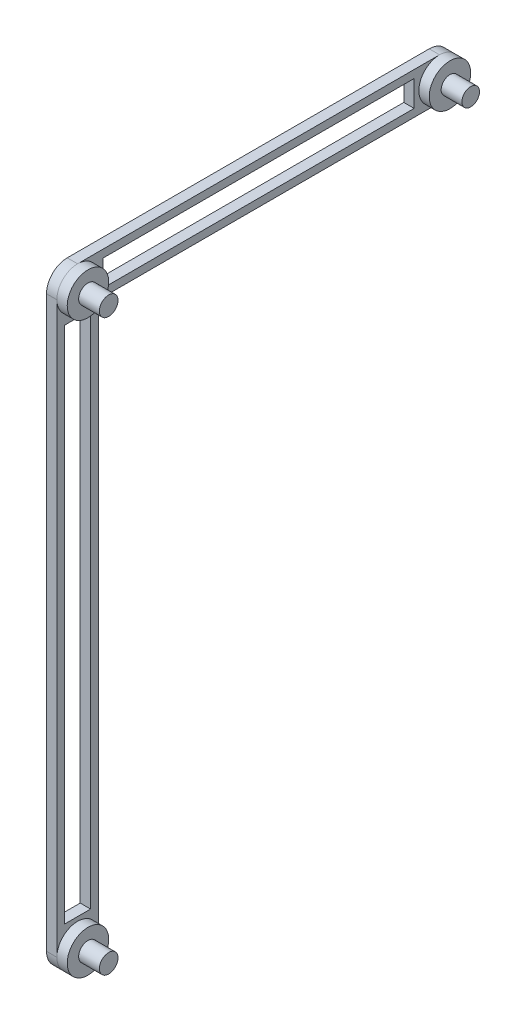
ISO-10303-21;
HEADER;
FILE_DESCRIPTION(('STEP AP214'),'2;1');
FILE_NAME('part.step','',(''),(''),'','','');
FILE_SCHEMA(('AUTOMOTIVE_DESIGN { 1 0 10303 214 1 1 1 1 }'));
ENDSEC;
DATA;
#1=APPLICATION_CONTEXT('core data for automotive mechanical design processes');
#2=APPLICATION_PROTOCOL_DEFINITION('international standard','automotive_design',2000,#1);
#3=PRODUCT_CONTEXT('',#1,'mechanical');
#4=PRODUCT('Part','Part','',(#3));
#5=PRODUCT_RELATED_PRODUCT_CATEGORY('part','',(#4));
#6=PRODUCT_DEFINITION_FORMATION('','',#4);
#7=PRODUCT_DEFINITION_CONTEXT('part definition',#1,'design');
#8=PRODUCT_DEFINITION('design','',#6,#7);
#9=PRODUCT_DEFINITION_SHAPE('','',#8);
#10=(LENGTH_UNIT() NAMED_UNIT(*) SI_UNIT(.MILLI.,.METRE.));
#11=(NAMED_UNIT(*) PLANE_ANGLE_UNIT() SI_UNIT($,.RADIAN.));
#12=(NAMED_UNIT(*) SI_UNIT($,.STERADIAN.) SOLID_ANGLE_UNIT());
#13=UNCERTAINTY_MEASURE_WITH_UNIT(LENGTH_MEASURE(1.E-05),#10,'distance_accuracy_value','');
#14=(GEOMETRIC_REPRESENTATION_CONTEXT(3) GLOBAL_UNCERTAINTY_ASSIGNED_CONTEXT((#13)) GLOBAL_UNIT_ASSIGNED_CONTEXT((#10,
#11,#12)) REPRESENTATION_CONTEXT('',''));
#15=CARTESIAN_POINT('',(0.,0.,0.));
#16=DIRECTION('',(0.,0.,1.));
#17=DIRECTION('',(1.,0.,0.));
#18=AXIS2_PLACEMENT_3D('',#15,#16,#17);
#19=CARTESIAN_POINT('',(1.,0.,0.));
#20=DIRECTION('',(1.,0.,0.));
#21=DIRECTION('',(0.,0.,-1.));
#22=AXIS2_PLACEMENT_3D('',#19,#20,#21);
#23=PLANE('',#22);
#24=DIRECTION('',(0.,1.,0.));
#25=VECTOR('',#24,1.);
#26=CARTESIAN_POINT('',(1.,1.25,-15.));
#27=LINE('',#26,#25);
#28=CARTESIAN_POINT('',(1.,-1.25,-15.));
#29=VERTEX_POINT('',#28);
#30=CARTESIAN_POINT('',(1.,1.25,-15.));
#31=VERTEX_POINT('',#30);
#32=EDGE_CURVE('E175',#29,#31,#27,.T.);
#33=ORIENTED_EDGE('',*,*,#32,.F.);
#34=DIRECTION('',(0.,0.,-1.));
#35=VECTOR('',#34,1.);
#36=CARTESIAN_POINT('',(1.,-1.25,15.));
#37=LINE('',#36,#35);
#38=CARTESIAN_POINT('',(1.,-1.25,15.));
#39=VERTEX_POINT('',#38);
#40=EDGE_CURVE('E179',#39,#29,#37,.T.);
#41=ORIENTED_EDGE('',*,*,#40,.F.);
#42=DIRECTION('',(0.,-1.,0.));
#43=VECTOR('',#42,1.);
#44=CARTESIAN_POINT('',(1.,1.25,15.));
#45=LINE('',#44,#43);
#46=CARTESIAN_POINT('',(1.,1.25,15.));
#47=VERTEX_POINT('',#46);
#48=EDGE_CURVE('E159',#47,#39,#45,.T.);
#49=ORIENTED_EDGE('',*,*,#48,.F.);
#50=DIRECTION('',(0.,0.,1.));
#51=VECTOR('',#50,1.);
#52=CARTESIAN_POINT('',(1.,1.25,15.));
#53=LINE('',#52,#51);
#54=EDGE_CURVE('E170',#31,#47,#53,.T.);
#55=ORIENTED_EDGE('',*,*,#54,.F.);
#56=EDGE_LOOP('',(#33,#41,#49,#55));
#57=FACE_BOUND('',#56,.T.);
#58=DIRECTION('',(0.,1.,0.));
#59=VECTOR('',#58,1.);
#60=CARTESIAN_POINT('',(1.,-2.5,16.2));
#61=LINE('',#60,#59);
#62=CARTESIAN_POINT('',(1.,-52.5,16.2));
#63=VERTEX_POINT('',#62);
#64=CARTESIAN_POINT('',(1.,-2.5,16.2));
#65=VERTEX_POINT('',#64);
#66=EDGE_CURVE('E201',#63,#65,#61,.T.);
#67=ORIENTED_EDGE('',*,*,#66,.F.);
#68=DIRECTION('',(0.,0.,-1.));
#69=VECTOR('',#68,1.);
#70=CARTESIAN_POINT('',(1.,-52.5,18.7));
#71=LINE('',#70,#69);
#72=CARTESIAN_POINT('',(1.,-52.5,18.7));
#73=VERTEX_POINT('',#72);
#74=EDGE_CURVE('E210',#73,#63,#71,.T.);
#75=ORIENTED_EDGE('',*,*,#74,.F.);
#76=DIRECTION('',(0.,-1.,0.));
#77=VECTOR('',#76,1.);
#78=CARTESIAN_POINT('',(1.,-2.5,18.7));
#79=LINE('',#78,#77);
#80=CARTESIAN_POINT('',(1.,-2.5,18.7));
#81=VERTEX_POINT('',#80);
#82=EDGE_CURVE('E207',#81,#73,#79,.T.);
#83=ORIENTED_EDGE('',*,*,#82,.F.);
#84=DIRECTION('',(0.,0.,1.));
#85=VECTOR('',#84,1.);
#86=CARTESIAN_POINT('',(1.,-2.5,18.7));
#87=LINE('',#86,#85);
#88=EDGE_CURVE('E203',#65,#81,#87,.T.);
#89=ORIENTED_EDGE('',*,*,#88,.F.);
#90=EDGE_LOOP('',(#67,#75,#83,#89));
#91=FACE_BOUND('',#90,.T.);
#92=DIRECTION('',(0.,0.,-1.));
#93=VECTOR('',#92,1.);
#94=CARTESIAN_POINT('',(1.,-2.,0.));
#95=LINE('',#94,#93);
#96=CARTESIAN_POINT('',(1.,-2.,15.45));
#97=VERTEX_POINT('',#96);
#98=CARTESIAN_POINT('',(1.,-2.,-17.45));
#99=VERTEX_POINT('',#98);
#100=EDGE_CURVE('E264',#97,#99,#95,.T.);
#101=ORIENTED_EDGE('',*,*,#100,.T.);
#102=CARTESIAN_POINT('',(1.,0.,-17.45));
#103=DIRECTION('',(1.,0.,0.));
#104=DIRECTION('',(0.,0.,-1.));
#105=AXIS2_PLACEMENT_3D('',#102,#103,#104);
#106=CIRCLE('',#105,2.);
#107=CARTESIAN_POINT('',(1.,2.,-17.45));
#108=VERTEX_POINT('',#107);
#109=EDGE_CURVE('E248',#108,#99,#106,.T.);
#110=ORIENTED_EDGE('',*,*,#109,.F.);
#111=DIRECTION('',(0.,0.,-1.));
#112=VECTOR('',#111,1.);
#113=CARTESIAN_POINT('',(1.,2.,0.));
#114=LINE('',#113,#112);
#115=CARTESIAN_POINT('',(1.,2.,17.45));
#116=VERTEX_POINT('',#115);
#117=EDGE_CURVE('E268',#116,#108,#114,.T.);
#118=ORIENTED_EDGE('',*,*,#117,.F.);
#119=CARTESIAN_POINT('',(1.,0.,17.45));
#120=DIRECTION('',(1.,0.,0.));
#121=DIRECTION('',(0.,0.,-1.));
#122=AXIS2_PLACEMENT_3D('',#119,#120,#121);
#123=CIRCLE('',#122,2.);
#124=CARTESIAN_POINT('',(1.,0.,19.45));
#125=VERTEX_POINT('',#124);
#126=EDGE_CURVE('E245',#125,#116,#123,.T.);
#127=ORIENTED_EDGE('',*,*,#126,.F.);
#128=DIRECTION('',(0.,-1.,0.));
#129=VECTOR('',#128,1.);
#130=CARTESIAN_POINT('',(1.,0.,19.45));
#131=LINE('',#130,#129);
#132=CARTESIAN_POINT('',(1.,-54.9,19.45));
#133=VERTEX_POINT('',#132);
#134=EDGE_CURVE('E271',#125,#133,#131,.T.);
#135=ORIENTED_EDGE('',*,*,#134,.T.);
#136=CARTESIAN_POINT('',(1.,-54.9,17.45));
#137=DIRECTION('',(1.,0.,0.));
#138=DIRECTION('',(0.,0.,-1.));
#139=AXIS2_PLACEMENT_3D('',#136,#137,#138);
#140=CIRCLE('',#139,2.);
#141=CARTESIAN_POINT('',(1.,-54.9,15.45));
#142=VERTEX_POINT('',#141);
#143=EDGE_CURVE('E252',#142,#133,#140,.T.);
#144=ORIENTED_EDGE('',*,*,#143,.F.);
#145=DIRECTION('',(0.,-1.,0.));
#146=VECTOR('',#145,1.);
#147=CARTESIAN_POINT('',(1.,0.,15.45));
#148=LINE('',#147,#146);
#149=EDGE_CURVE('E262',#97,#142,#148,.T.);
#150=ORIENTED_EDGE('',*,*,#149,.F.);
#151=EDGE_LOOP('',(#101,#110,#118,#127,#135,#144,#150));
#152=FACE_BOUND('',#151,.T.);
#153=ADVANCED_FACE('F35',(#57,#91,#152),#23,.T.);
#154=CARTESIAN_POINT('',(1.,0.,15.45));
#155=DIRECTION('',(0.,0.,-1.));
#156=DIRECTION('',(0.,1.,0.));
#157=AXIS2_PLACEMENT_3D('',#154,#155,#156);
#158=PLANE('',#157);
#159=ORIENTED_EDGE('',*,*,#149,.T.);
#160=DIRECTION('',(-1.,0.,0.));
#161=VECTOR('',#160,1.);
#162=CARTESIAN_POINT('',(0.,-54.9,15.45));
#163=LINE('',#162,#161);
#164=CARTESIAN_POINT('',(0.,-54.9,15.45));
#165=VERTEX_POINT('',#164);
#166=EDGE_CURVE('E228',#142,#165,#163,.T.);
#167=ORIENTED_EDGE('',*,*,#166,.T.);
#168=DIRECTION('',(0.,-1.,0.));
#169=VECTOR('',#168,1.);
#170=CARTESIAN_POINT('',(0.,0.,15.45));
#171=LINE('',#170,#169);
#172=CARTESIAN_POINT('',(0.,-2.,15.45));
#173=VERTEX_POINT('',#172);
#174=EDGE_CURVE('E258',#173,#165,#171,.T.);
#175=ORIENTED_EDGE('',*,*,#174,.F.);
#176=DIRECTION('',(-1.,0.,0.));
#177=VECTOR('',#176,1.);
#178=CARTESIAN_POINT('',(1.,-2.,15.45));
#179=LINE('',#178,#177);
#180=EDGE_CURVE('E274',#97,#173,#179,.T.);
#181=ORIENTED_EDGE('',*,*,#180,.F.);
#182=EDGE_LOOP('',(#159,#167,#175,#181));
#183=FACE_BOUND('',#182,.T.);
#184=ADVANCED_FACE('F328',(#183),#158,.T.);
#185=CARTESIAN_POINT('',(1.,-2.,0.));
#186=DIRECTION('',(0.,1.,0.));
#187=DIRECTION('',(0.,0.,1.));
#188=AXIS2_PLACEMENT_3D('',#185,#186,#187);
#189=PLANE('',#188);
#190=DIRECTION('',(0.,0.,-1.));
#191=VECTOR('',#190,1.);
#192=CARTESIAN_POINT('',(0.,-2.,0.));
#193=LINE('',#192,#191);
#194=CARTESIAN_POINT('',(0.,-2.,-17.45));
#195=VERTEX_POINT('',#194);
#196=EDGE_CURVE('E277',#173,#195,#193,.T.);
#197=ORIENTED_EDGE('',*,*,#196,.T.);
#198=DIRECTION('',(-1.,0.,0.));
#199=VECTOR('',#198,1.);
#200=CARTESIAN_POINT('',(1.,-2.,-17.45));
#201=LINE('',#200,#199);
#202=EDGE_CURVE('E11',#195,#99,#201,.F.);
#203=ORIENTED_EDGE('',*,*,#202,.T.);
#204=ORIENTED_EDGE('',*,*,#100,.F.);
#205=ORIENTED_EDGE('',*,*,#180,.T.);
#206=EDGE_LOOP('',(#197,#203,#204,#205));
#207=FACE_BOUND('',#206,.T.);
#208=ADVANCED_FACE('F318',(#207),#189,.F.);
#209=CARTESIAN_POINT('',(1.,2.,0.));
#210=DIRECTION('',(0.,1.,0.));
#211=DIRECTION('',(0.,0.,1.));
#212=AXIS2_PLACEMENT_3D('',#209,#210,#211);
#213=PLANE('',#212);
#214=DIRECTION('',(0.,0.,-1.));
#215=VECTOR('',#214,1.);
#216=CARTESIAN_POINT('',(0.,2.,0.));
#217=LINE('',#216,#215);
#218=CARTESIAN_POINT('',(0.,2.,17.45));
#219=VERTEX_POINT('',#218);
#220=CARTESIAN_POINT('',(0.,2.,-17.45));
#221=VERTEX_POINT('',#220);
#222=EDGE_CURVE('E279',#219,#221,#217,.T.);
#223=ORIENTED_EDGE('',*,*,#222,.F.);
#224=DIRECTION('',(-1.,0.,0.));
#225=VECTOR('',#224,1.);
#226=CARTESIAN_POINT('',(1.,2.,17.45));
#227=LINE('',#226,#225);
#228=EDGE_CURVE('E44',#219,#116,#227,.F.);
#229=ORIENTED_EDGE('',*,*,#228,.T.);
#230=ORIENTED_EDGE('',*,*,#117,.T.);
#231=DIRECTION('',(-1.,0.,0.));
#232=VECTOR('',#231,1.);
#233=CARTESIAN_POINT('',(1.,2.,-17.45));
#234=LINE('',#233,#232);
#235=EDGE_CURVE('E299',#108,#221,#234,.T.);
#236=ORIENTED_EDGE('',*,*,#235,.T.);
#237=EDGE_LOOP('',(#223,#229,#230,#236));
#238=FACE_BOUND('',#237,.T.);
#239=ADVANCED_FACE('F371',(#238),#213,.T.);
#240=CARTESIAN_POINT('',(1.,0.,19.45));
#241=DIRECTION('',(0.,0.,-1.));
#242=DIRECTION('',(0.,1.,0.));
#243=AXIS2_PLACEMENT_3D('',#240,#241,#242);
#244=PLANE('',#243);
#245=DIRECTION('',(0.,-1.,0.));
#246=VECTOR('',#245,1.);
#247=CARTESIAN_POINT('',(0.,0.,19.45));
#248=LINE('',#247,#246);
#249=CARTESIAN_POINT('',(0.,0.,19.45));
#250=VERTEX_POINT('',#249);
#251=CARTESIAN_POINT('',(0.,-54.9,19.45));
#252=VERTEX_POINT('',#251);
#253=EDGE_CURVE('E265',#250,#252,#248,.T.);
#254=ORIENTED_EDGE('',*,*,#253,.T.);
#255=DIRECTION('',(-1.,0.,0.));
#256=VECTOR('',#255,1.);
#257=CARTESIAN_POINT('',(1.,-54.9,19.45));
#258=LINE('',#257,#256);
#259=EDGE_CURVE('E297',#252,#133,#258,.F.);
#260=ORIENTED_EDGE('',*,*,#259,.T.);
#261=ORIENTED_EDGE('',*,*,#134,.F.);
#262=DIRECTION('',(-1.,0.,0.));
#263=VECTOR('',#262,1.);
#264=CARTESIAN_POINT('',(0.,0.,19.45));
#265=LINE('',#264,#263);
#266=EDGE_CURVE('E294',#125,#250,#265,.T.);
#267=ORIENTED_EDGE('',*,*,#266,.T.);
#268=EDGE_LOOP('',(#254,#260,#261,#267));
#269=FACE_BOUND('',#268,.T.);
#270=ADVANCED_FACE('F340',(#269),#244,.F.);
#271=CARTESIAN_POINT('',(0.,0.,0.));
#272=DIRECTION('',(1.,0.,0.));
#273=DIRECTION('',(0.,0.,-1.));
#274=AXIS2_PLACEMENT_3D('',#271,#272,#273);
#275=PLANE('',#274);
#276=DIRECTION('',(0.,0.,1.));
#277=VECTOR('',#276,1.);
#278=CARTESIAN_POINT('',(0.,-1.25,15.));
#279=LINE('',#278,#277);
#280=CARTESIAN_POINT('',(0.,-1.25,-15.));
#281=VERTEX_POINT('',#280);
#282=CARTESIAN_POINT('',(0.,-1.25,15.));
#283=VERTEX_POINT('',#282);
#284=EDGE_CURVE('E646',#281,#283,#279,.T.);
#285=ORIENTED_EDGE('',*,*,#284,.F.);
#286=DIRECTION('',(0.,-1.,0.));
#287=VECTOR('',#286,1.);
#288=CARTESIAN_POINT('',(0.,1.25,-15.));
#289=LINE('',#288,#287);
#290=CARTESIAN_POINT('',(0.,1.25,-15.));
#291=VERTEX_POINT('',#290);
#292=EDGE_CURVE('E191',#291,#281,#289,.T.);
#293=ORIENTED_EDGE('',*,*,#292,.F.);
#294=DIRECTION('',(0.,0.,-1.));
#295=VECTOR('',#294,1.);
#296=CARTESIAN_POINT('',(0.,1.25,15.));
#297=LINE('',#296,#295);
#298=CARTESIAN_POINT('',(0.,1.25,15.));
#299=VERTEX_POINT('',#298);
#300=EDGE_CURVE('E188',#299,#291,#297,.T.);
#301=ORIENTED_EDGE('',*,*,#300,.F.);
#302=DIRECTION('',(0.,1.,0.));
#303=VECTOR('',#302,1.);
#304=CARTESIAN_POINT('',(0.,1.25,15.));
#305=LINE('',#304,#303);
#306=EDGE_CURVE('E162',#283,#299,#305,.T.);
#307=ORIENTED_EDGE('',*,*,#306,.F.);
#308=EDGE_LOOP('',(#285,#293,#301,#307));
#309=FACE_BOUND('',#308,.T.);
#310=DIRECTION('',(0.,0.,1.));
#311=VECTOR('',#310,1.);
#312=CARTESIAN_POINT('',(0.,-52.5,18.7));
#313=LINE('',#312,#311);
#314=CARTESIAN_POINT('',(0.,-52.5,16.2));
#315=VERTEX_POINT('',#314);
#316=CARTESIAN_POINT('',(0.,-52.5,18.7));
#317=VERTEX_POINT('',#316);
#318=EDGE_CURVE('E195',#315,#317,#313,.T.);
#319=ORIENTED_EDGE('',*,*,#318,.F.);
#320=DIRECTION('',(0.,-1.,0.));
#321=VECTOR('',#320,1.);
#322=CARTESIAN_POINT('',(0.,-2.5,16.2));
#323=LINE('',#322,#321);
#324=CARTESIAN_POINT('',(0.,-2.5,16.2));
#325=VERTEX_POINT('',#324);
#326=EDGE_CURVE('E198',#325,#315,#323,.T.);
#327=ORIENTED_EDGE('',*,*,#326,.F.);
#328=DIRECTION('',(0.,0.,-1.));
#329=VECTOR('',#328,1.);
#330=CARTESIAN_POINT('',(0.,-2.5,18.7));
#331=LINE('',#330,#329);
#332=CARTESIAN_POINT('',(0.,-2.5,18.7));
#333=VERTEX_POINT('',#332);
#334=EDGE_CURVE('E200',#333,#325,#331,.T.);
#335=ORIENTED_EDGE('',*,*,#334,.F.);
#336=DIRECTION('',(0.,1.,0.));
#337=VECTOR('',#336,1.);
#338=CARTESIAN_POINT('',(0.,-2.5,18.7));
#339=LINE('',#338,#337);
#340=EDGE_CURVE('E192',#317,#333,#339,.T.);
#341=ORIENTED_EDGE('',*,*,#340,.F.);
#342=EDGE_LOOP('',(#319,#327,#335,#341));
#343=FACE_BOUND('',#342,.T.);
#344=ORIENTED_EDGE('',*,*,#174,.T.);
#345=CARTESIAN_POINT('',(0.,-54.9,17.45));
#346=DIRECTION('',(1.,0.,0.));
#347=DIRECTION('',(0.,0.,-1.));
#348=AXIS2_PLACEMENT_3D('',#345,#346,#347);
#349=CIRCLE('',#348,2.);
#350=CARTESIAN_POINT('',(0.,-56.9,17.45));
#351=VERTEX_POINT('',#350);
#352=EDGE_CURVE('E292',#165,#351,#349,.F.);
#353=ORIENTED_EDGE('',*,*,#352,.T.);
#354=CARTESIAN_POINT('',(0.,-54.9,17.45));
#355=DIRECTION('',(1.,0.,0.));
#356=DIRECTION('',(0.,0.,-1.));
#357=AXIS2_PLACEMENT_3D('',#354,#355,#356);
#358=CIRCLE('',#357,2.);
#359=EDGE_CURVE('E290',#351,#252,#358,.F.);
#360=ORIENTED_EDGE('',*,*,#359,.T.);
#361=ORIENTED_EDGE('',*,*,#253,.F.);
#362=CARTESIAN_POINT('',(0.,0.,17.45));
#363=DIRECTION('',(1.,0.,0.));
#364=DIRECTION('',(0.,0.,-1.));
#365=AXIS2_PLACEMENT_3D('',#362,#363,#364);
#366=CIRCLE('',#365,2.);
#367=EDGE_CURVE('E288',#250,#219,#366,.F.);
#368=ORIENTED_EDGE('',*,*,#367,.T.);
#369=ORIENTED_EDGE('',*,*,#222,.T.);
#370=CARTESIAN_POINT('',(0.,0.,-17.45));
#371=DIRECTION('',(1.,0.,0.));
#372=DIRECTION('',(0.,0.,-1.));
#373=AXIS2_PLACEMENT_3D('',#370,#371,#372);
#374=CIRCLE('',#373,2.);
#375=CARTESIAN_POINT('',(0.,0.,-19.45));
#376=VERTEX_POINT('',#375);
#377=EDGE_CURVE('E57',#221,#376,#374,.F.);
#378=ORIENTED_EDGE('',*,*,#377,.T.);
#379=CARTESIAN_POINT('',(0.,0.,-17.45));
#380=DIRECTION('',(1.,0.,0.));
#381=DIRECTION('',(0.,0.,-1.));
#382=AXIS2_PLACEMENT_3D('',#379,#380,#381);
#383=CIRCLE('',#382,2.);
#384=EDGE_CURVE('E52',#376,#195,#383,.F.);
#385=ORIENTED_EDGE('',*,*,#384,.T.);
#386=ORIENTED_EDGE('',*,*,#196,.F.);
#387=EDGE_LOOP('',(#344,#353,#360,#361,#368,#369,#378,#385,#386));
#388=FACE_BOUND('',#387,.T.);
#389=ADVANCED_FACE('F331',(#309,#343,#388),#275,.F.);
#390=CARTESIAN_POINT('',(2.,-54.9,17.45));
#391=DIRECTION('',(-1.,0.,0.));
#392=DIRECTION('',(0.,0.,1.));
#393=AXIS2_PLACEMENT_3D('',#390,#391,#392);
#394=CYLINDRICAL_SURFACE('',#393,2.);
#395=CARTESIAN_POINT('',(2.,-54.9,17.45));
#396=DIRECTION('',(1.,0.,0.));
#397=DIRECTION('',(0.,0.,-1.));
#398=AXIS2_PLACEMENT_3D('',#395,#396,#397);
#399=CIRCLE('',#398,2.);
#400=CARTESIAN_POINT('',(2.,-54.9,15.45));
#401=VERTEX_POINT('',#400);
#402=EDGE_CURVE('E255',#401,#401,#399,.T.);
#403=ORIENTED_EDGE('',*,*,#402,.F.);
#404=EDGE_LOOP('',(#403));
#405=FACE_BOUND('',#404,.T.);
#406=ORIENTED_EDGE('',*,*,#143,.T.);
#407=CARTESIAN_POINT('',(1.,-56.9,17.45));
#408=VERTEX_POINT('',#407);
#409=EDGE_CURVE('E241',#133,#408,#140,.T.);
#410=ORIENTED_EDGE('',*,*,#409,.T.);
#411=EDGE_CURVE('E261',#408,#142,#140,.T.);
#412=ORIENTED_EDGE('',*,*,#411,.T.);
#413=EDGE_LOOP('',(#406,#410,#412));
#414=FACE_BOUND('',#413,.T.);
#415=ADVANCED_FACE('F345',(#405,#414),#394,.T.);
#416=CARTESIAN_POINT('',(2.,0.,0.));
#417=DIRECTION('',(1.,0.,0.));
#418=DIRECTION('',(0.,0.,-1.));
#419=AXIS2_PLACEMENT_3D('',#416,#417,#418);
#420=PLANE('',#419);
#421=CARTESIAN_POINT('',(2.,-54.9,17.45));
#422=DIRECTION('',(1.,0.,0.));
#423=DIRECTION('',(0.,0.,-1.));
#424=AXIS2_PLACEMENT_3D('',#421,#422,#423);
#425=CIRCLE('',#424,0.9);
#426=CARTESIAN_POINT('',(2.,-54.9,16.55));
#427=VERTEX_POINT('',#426);
#428=EDGE_CURVE('E225',#427,#427,#425,.T.);
#429=ORIENTED_EDGE('',*,*,#428,.F.);
#430=EDGE_LOOP('',(#429));
#431=FACE_BOUND('',#430,.T.);
#432=ORIENTED_EDGE('',*,*,#402,.T.);
#433=EDGE_LOOP('',(#432));
#434=FACE_BOUND('',#433,.T.);
#435=ADVANCED_FACE('F398',(#431,#434),#420,.T.);
#436=CARTESIAN_POINT('',(2.,0.,17.45));
#437=DIRECTION('',(-1.,0.,0.));
#438=DIRECTION('',(0.,0.,1.));
#439=AXIS2_PLACEMENT_3D('',#436,#437,#438);
#440=CYLINDRICAL_SURFACE('',#439,2.);
#441=CARTESIAN_POINT('',(2.,0.,17.45));
#442=DIRECTION('',(1.,0.,0.));
#443=DIRECTION('',(0.,0.,-1.));
#444=AXIS2_PLACEMENT_3D('',#441,#442,#443);
#445=CIRCLE('',#444,2.);
#446=CARTESIAN_POINT('',(2.,0.,15.45));
#447=VERTEX_POINT('',#446);
#448=EDGE_CURVE('E249',#447,#447,#445,.T.);
#449=ORIENTED_EDGE('',*,*,#448,.F.);
#450=EDGE_LOOP('',(#449));
#451=FACE_BOUND('',#450,.T.);
#452=EDGE_CURVE('E253',#116,#125,#123,.T.);
#453=ORIENTED_EDGE('',*,*,#452,.T.);
#454=ORIENTED_EDGE('',*,*,#126,.T.);
#455=EDGE_LOOP('',(#453,#454));
#456=FACE_BOUND('',#455,.T.);
#457=ADVANCED_FACE('F406',(#451,#456),#440,.T.);
#458=CARTESIAN_POINT('',(2.,0.,0.));
#459=DIRECTION('',(1.,0.,0.));
#460=DIRECTION('',(0.,0.,-1.));
#461=AXIS2_PLACEMENT_3D('',#458,#459,#460);
#462=PLANE('',#461);
#463=CARTESIAN_POINT('',(2.,0.,17.45));
#464=DIRECTION('',(1.,0.,0.));
#465=DIRECTION('',(0.,0.,-1.));
#466=AXIS2_PLACEMENT_3D('',#463,#464,#465);
#467=CIRCLE('',#466,0.9);
#468=CARTESIAN_POINT('',(2.,0.,16.55));
#469=VERTEX_POINT('',#468);
#470=EDGE_CURVE('E235',#469,#469,#467,.T.);
#471=ORIENTED_EDGE('',*,*,#470,.F.);
#472=EDGE_LOOP('',(#471));
#473=FACE_BOUND('',#472,.T.);
#474=ORIENTED_EDGE('',*,*,#448,.T.);
#475=EDGE_LOOP('',(#474));
#476=FACE_BOUND('',#475,.T.);
#477=ADVANCED_FACE('F413',(#473,#476),#462,.T.);
#478=CARTESIAN_POINT('',(2.,0.,-17.45));
#479=DIRECTION('',(-1.,0.,0.));
#480=DIRECTION('',(0.,0.,1.));
#481=AXIS2_PLACEMENT_3D('',#478,#479,#480);
#482=CYLINDRICAL_SURFACE('',#481,2.);
#483=CARTESIAN_POINT('',(2.,0.,-17.45));
#484=DIRECTION('',(1.,0.,0.));
#485=DIRECTION('',(0.,0.,-1.));
#486=AXIS2_PLACEMENT_3D('',#483,#484,#485);
#487=CIRCLE('',#486,2.);
#488=CARTESIAN_POINT('',(2.,0.,-19.45));
#489=VERTEX_POINT('',#488);
#490=EDGE_CURVE('E242',#489,#489,#487,.T.);
#491=ORIENTED_EDGE('',*,*,#490,.F.);
#492=EDGE_LOOP('',(#491));
#493=FACE_BOUND('',#492,.T.);
#494=CARTESIAN_POINT('',(1.,0.,-19.45));
#495=VERTEX_POINT('',#494);
#496=EDGE_CURVE('E246',#495,#108,#106,.T.);
#497=ORIENTED_EDGE('',*,*,#496,.T.);
#498=ORIENTED_EDGE('',*,*,#109,.T.);
#499=EDGE_CURVE('E238',#99,#495,#106,.T.);
#500=ORIENTED_EDGE('',*,*,#499,.T.);
#501=EDGE_LOOP('',(#497,#498,#500));
#502=FACE_BOUND('',#501,.T.);
#503=ADVANCED_FACE('F322',(#493,#502),#482,.T.);
#504=CARTESIAN_POINT('',(2.,0.,0.));
#505=DIRECTION('',(1.,0.,0.));
#506=DIRECTION('',(0.,0.,-1.));
#507=AXIS2_PLACEMENT_3D('',#504,#505,#506);
#508=PLANE('',#507);
#509=CARTESIAN_POINT('',(2.,0.,-17.45));
#510=DIRECTION('',(1.,0.,0.));
#511=DIRECTION('',(0.,0.,-1.));
#512=AXIS2_PLACEMENT_3D('',#509,#510,#511);
#513=CIRCLE('',#512,0.85);
#514=CARTESIAN_POINT('',(2.,0.,-18.3));
#515=VERTEX_POINT('',#514);
#516=EDGE_CURVE('E229',#515,#515,#513,.T.);
#517=ORIENTED_EDGE('',*,*,#516,.F.);
#518=EDGE_LOOP('',(#517));
#519=FACE_BOUND('',#518,.T.);
#520=ORIENTED_EDGE('',*,*,#490,.T.);
#521=EDGE_LOOP('',(#520));
#522=FACE_BOUND('',#521,.T.);
#523=ADVANCED_FACE('F428',(#519,#522),#508,.T.);
#524=CARTESIAN_POINT('',(4.,0.,17.45));
#525=DIRECTION('',(-1.,0.,0.));
#526=DIRECTION('',(0.,0.,1.));
#527=AXIS2_PLACEMENT_3D('',#524,#525,#526);
#528=CYLINDRICAL_SURFACE('',#527,0.9);
#529=CARTESIAN_POINT('',(4.,0.,17.45));
#530=DIRECTION('',(1.,0.,0.));
#531=DIRECTION('',(0.,0.,-1.));
#532=AXIS2_PLACEMENT_3D('',#529,#530,#531);
#533=CIRCLE('',#532,0.9);
#534=CARTESIAN_POINT('',(4.,0.,16.55));
#535=VERTEX_POINT('',#534);
#536=EDGE_CURVE('E232',#535,#535,#533,.T.);
#537=ORIENTED_EDGE('',*,*,#536,.F.);
#538=EDGE_LOOP('',(#537));
#539=FACE_BOUND('',#538,.T.);
#540=ORIENTED_EDGE('',*,*,#470,.T.);
#541=EDGE_LOOP('',(#540));
#542=FACE_BOUND('',#541,.T.);
#543=ADVANCED_FACE('F436',(#539,#542),#528,.T.);
#544=CARTESIAN_POINT('',(4.,0.,17.45));
#545=DIRECTION('',(1.,0.,0.));
#546=DIRECTION('',(0.,0.,-1.));
#547=AXIS2_PLACEMENT_3D('',#544,#545,#546);
#548=PLANE('',#547);
#549=ORIENTED_EDGE('',*,*,#536,.T.);
#550=EDGE_LOOP('',(#549));
#551=FACE_BOUND('',#550,.T.);
#552=ADVANCED_FACE('F444',(#551),#548,.T.);
#553=CARTESIAN_POINT('',(4.,0.,-17.45));
#554=DIRECTION('',(-1.,0.,0.));
#555=DIRECTION('',(0.,0.,1.));
#556=AXIS2_PLACEMENT_3D('',#553,#554,#555);
#557=CYLINDRICAL_SURFACE('',#556,0.85);
#558=CARTESIAN_POINT('',(4.,0.,-17.45));
#559=DIRECTION('',(1.,0.,0.));
#560=DIRECTION('',(0.,0.,-1.));
#561=AXIS2_PLACEMENT_3D('',#558,#559,#560);
#562=CIRCLE('',#561,0.85);
#563=CARTESIAN_POINT('',(4.,0.,-18.3));
#564=VERTEX_POINT('',#563);
#565=EDGE_CURVE('E224',#564,#564,#562,.T.);
#566=ORIENTED_EDGE('',*,*,#565,.F.);
#567=EDGE_LOOP('',(#566));
#568=FACE_BOUND('',#567,.T.);
#569=ORIENTED_EDGE('',*,*,#516,.T.);
#570=EDGE_LOOP('',(#569));
#571=FACE_BOUND('',#570,.T.);
#572=ADVANCED_FACE('F452',(#568,#571),#557,.T.);
#573=CARTESIAN_POINT('',(4.,0.,-17.45));
#574=DIRECTION('',(1.,0.,0.));
#575=DIRECTION('',(0.,0.,-1.));
#576=AXIS2_PLACEMENT_3D('',#573,#574,#575);
#577=PLANE('',#576);
#578=ORIENTED_EDGE('',*,*,#565,.T.);
#579=EDGE_LOOP('',(#578));
#580=FACE_BOUND('',#579,.T.);
#581=ADVANCED_FACE('F460',(#580),#577,.T.);
#582=CARTESIAN_POINT('',(4.,-54.9,17.45));
#583=DIRECTION('',(-1.,0.,0.));
#584=DIRECTION('',(0.,0.,1.));
#585=AXIS2_PLACEMENT_3D('',#582,#583,#584);
#586=CYLINDRICAL_SURFACE('',#585,0.9);
#587=CARTESIAN_POINT('',(4.,-54.9,17.45));
#588=DIRECTION('',(1.,0.,0.));
#589=DIRECTION('',(0.,0.,-1.));
#590=AXIS2_PLACEMENT_3D('',#587,#588,#589);
#591=CIRCLE('',#590,0.9);
#592=CARTESIAN_POINT('',(4.,-54.9,16.55));
#593=VERTEX_POINT('',#592);
#594=EDGE_CURVE('E190',#593,#593,#591,.T.);
#595=ORIENTED_EDGE('',*,*,#594,.F.);
#596=EDGE_LOOP('',(#595));
#597=FACE_BOUND('',#596,.T.);
#598=ORIENTED_EDGE('',*,*,#428,.T.);
#599=EDGE_LOOP('',(#598));
#600=FACE_BOUND('',#599,.T.);
#601=ADVANCED_FACE('F468',(#597,#600),#586,.T.);
#602=CARTESIAN_POINT('',(4.,-54.9,17.45));
#603=DIRECTION('',(1.,0.,0.));
#604=DIRECTION('',(0.,0.,-1.));
#605=AXIS2_PLACEMENT_3D('',#602,#603,#604);
#606=PLANE('',#605);
#607=ORIENTED_EDGE('',*,*,#594,.T.);
#608=EDGE_LOOP('',(#607));
#609=FACE_BOUND('',#608,.T.);
#610=ADVANCED_FACE('F476',(#609),#606,.T.);
#611=CARTESIAN_POINT('',(-50.062460986252,-2.5,16.2));
#612=DIRECTION('',(0.,0.,-1.));
#613=DIRECTION('',(0.,1.,0.));
#614=AXIS2_PLACEMENT_3D('',#611,#612,#613);
#615=PLANE('',#614);
#616=ORIENTED_EDGE('',*,*,#326,.T.);
#617=DIRECTION('',(1.,0.,0.));
#618=VECTOR('',#617,1.);
#619=CARTESIAN_POINT('',(-50.062460986252,-52.5,16.2));
#620=LINE('',#619,#618);
#621=EDGE_CURVE('E196',#315,#63,#620,.T.);
#622=ORIENTED_EDGE('',*,*,#621,.T.);
#623=ORIENTED_EDGE('',*,*,#66,.T.);
#624=DIRECTION('',(1.,0.,0.));
#625=VECTOR('',#624,1.);
#626=CARTESIAN_POINT('',(-50.062460986252,-2.5,16.2));
#627=LINE('',#626,#625);
#628=EDGE_CURVE('E213',#325,#65,#627,.T.);
#629=ORIENTED_EDGE('',*,*,#628,.F.);
#630=EDGE_LOOP('',(#616,#622,#623,#629));
#631=FACE_BOUND('',#630,.T.);
#632=ADVANCED_FACE('F484',(#631),#615,.F.);
#633=CARTESIAN_POINT('',(-50.062460986252,-52.5,18.7));
#634=DIRECTION('',(0.,-1.,0.));
#635=DIRECTION('',(0.,0.,-1.));
#636=AXIS2_PLACEMENT_3D('',#633,#634,#635);
#637=PLANE('',#636);
#638=ORIENTED_EDGE('',*,*,#318,.T.);
#639=DIRECTION('',(1.,0.,0.));
#640=VECTOR('',#639,1.);
#641=CARTESIAN_POINT('',(-50.062460986252,-52.5,18.7));
#642=LINE('',#641,#640);
#643=EDGE_CURVE('E215',#317,#73,#642,.T.);
#644=ORIENTED_EDGE('',*,*,#643,.T.);
#645=ORIENTED_EDGE('',*,*,#74,.T.);
#646=ORIENTED_EDGE('',*,*,#621,.F.);
#647=EDGE_LOOP('',(#638,#644,#645,#646));
#648=FACE_BOUND('',#647,.T.);
#649=ADVANCED_FACE('F492',(#648),#637,.F.);
#650=CARTESIAN_POINT('',(-50.062460986252,-2.5,18.7));
#651=DIRECTION('',(0.,0.,1.));
#652=DIRECTION('',(0.,-1.,0.));
#653=AXIS2_PLACEMENT_3D('',#650,#651,#652);
#654=PLANE('',#653);
#655=ORIENTED_EDGE('',*,*,#340,.T.);
#656=DIRECTION('',(1.,0.,0.));
#657=VECTOR('',#656,1.);
#658=CARTESIAN_POINT('',(-50.062460986252,-2.5,18.7));
#659=LINE('',#658,#657);
#660=EDGE_CURVE('E217',#333,#81,#659,.T.);
#661=ORIENTED_EDGE('',*,*,#660,.T.);
#662=ORIENTED_EDGE('',*,*,#82,.T.);
#663=ORIENTED_EDGE('',*,*,#643,.F.);
#664=EDGE_LOOP('',(#655,#661,#662,#663));
#665=FACE_BOUND('',#664,.T.);
#666=ADVANCED_FACE('F500',(#665),#654,.F.);
#667=CARTESIAN_POINT('',(-50.062460986252,-2.5,18.7));
#668=DIRECTION('',(0.,1.,0.));
#669=DIRECTION('',(0.,0.,1.));
#670=AXIS2_PLACEMENT_3D('',#667,#668,#669);
#671=PLANE('',#670);
#672=ORIENTED_EDGE('',*,*,#334,.T.);
#673=ORIENTED_EDGE('',*,*,#628,.T.);
#674=ORIENTED_EDGE('',*,*,#88,.T.);
#675=ORIENTED_EDGE('',*,*,#660,.F.);
#676=EDGE_LOOP('',(#672,#673,#674,#675));
#677=FACE_BOUND('',#676,.T.);
#678=ADVANCED_FACE('F508',(#677),#671,.F.);
#679=CARTESIAN_POINT('',(-50.062460986252,1.25,-15.));
#680=DIRECTION('',(0.,0.,-1.));
#681=DIRECTION('',(-1.,0.,0.));
#682=AXIS2_PLACEMENT_3D('',#679,#680,#681);
#683=PLANE('',#682);
#684=ORIENTED_EDGE('',*,*,#292,.T.);
#685=DIRECTION('',(1.,0.,0.));
#686=VECTOR('',#685,1.);
#687=CARTESIAN_POINT('',(-50.062460986252,-1.25,-15.));
#688=LINE('',#687,#686);
#689=EDGE_CURVE('E184',#281,#29,#688,.T.);
#690=ORIENTED_EDGE('',*,*,#689,.T.);
#691=ORIENTED_EDGE('',*,*,#32,.T.);
#692=DIRECTION('',(1.,0.,0.));
#693=VECTOR('',#692,1.);
#694=CARTESIAN_POINT('',(-50.062460986252,1.25,-15.));
#695=LINE('',#694,#693);
#696=EDGE_CURVE('E166',#291,#31,#695,.T.);
#697=ORIENTED_EDGE('',*,*,#696,.F.);
#698=EDGE_LOOP('',(#684,#690,#691,#697));
#699=FACE_BOUND('',#698,.T.);
#700=ADVANCED_FACE('F516',(#699),#683,.F.);
#701=CARTESIAN_POINT('',(-50.062460986252,-1.25,15.));
#702=DIRECTION('',(0.,-1.,0.));
#703=DIRECTION('',(0.,0.,-1.));
#704=AXIS2_PLACEMENT_3D('',#701,#702,#703);
#705=PLANE('',#704);
#706=ORIENTED_EDGE('',*,*,#284,.T.);
#707=DIRECTION('',(1.,0.,0.));
#708=VECTOR('',#707,1.);
#709=CARTESIAN_POINT('',(-50.062460986252,-1.25,15.));
#710=LINE('',#709,#708);
#711=EDGE_CURVE('E165',#283,#39,#710,.T.);
#712=ORIENTED_EDGE('',*,*,#711,.T.);
#713=ORIENTED_EDGE('',*,*,#40,.T.);
#714=ORIENTED_EDGE('',*,*,#689,.F.);
#715=EDGE_LOOP('',(#706,#712,#713,#714));
#716=FACE_BOUND('',#715,.T.);
#717=ADVANCED_FACE('F524',(#716),#705,.F.);
#718=CARTESIAN_POINT('',(-50.062460986252,1.25,15.));
#719=DIRECTION('',(0.,0.,1.));
#720=DIRECTION('',(1.,0.,0.));
#721=AXIS2_PLACEMENT_3D('',#718,#719,#720);
#722=PLANE('',#721);
#723=ORIENTED_EDGE('',*,*,#306,.T.);
#724=DIRECTION('',(1.,0.,0.));
#725=VECTOR('',#724,1.);
#726=CARTESIAN_POINT('',(-50.062460986252,1.25,15.));
#727=LINE('',#726,#725);
#728=EDGE_CURVE('E154',#299,#47,#727,.T.);
#729=ORIENTED_EDGE('',*,*,#728,.T.);
#730=ORIENTED_EDGE('',*,*,#48,.T.);
#731=ORIENTED_EDGE('',*,*,#711,.F.);
#732=EDGE_LOOP('',(#723,#729,#730,#731));
#733=FACE_BOUND('',#732,.T.);
#734=ADVANCED_FACE('F156',(#733),#722,.F.);
#735=CARTESIAN_POINT('',(-50.062460986252,1.25,15.));
#736=DIRECTION('',(0.,1.,0.));
#737=DIRECTION('',(0.,0.,1.));
#738=AXIS2_PLACEMENT_3D('',#735,#736,#737);
#739=PLANE('',#738);
#740=ORIENTED_EDGE('',*,*,#300,.T.);
#741=ORIENTED_EDGE('',*,*,#696,.T.);
#742=ORIENTED_EDGE('',*,*,#54,.T.);
#743=ORIENTED_EDGE('',*,*,#728,.F.);
#744=EDGE_LOOP('',(#740,#741,#742,#743));
#745=FACE_BOUND('',#744,.T.);
#746=ADVANCED_FACE('F171',(#745),#739,.F.);
#747=CARTESIAN_POINT('',(1.,-54.9,17.45));
#748=DIRECTION('',(-1.,0.,0.));
#749=DIRECTION('',(0.,0.,1.));
#750=AXIS2_PLACEMENT_3D('',#747,#748,#749);
#751=CYLINDRICAL_SURFACE('',#750,2.);
#752=DIRECTION('',(-1.,0.,0.));
#753=VECTOR('',#752,1.);
#754=CARTESIAN_POINT('',(1.,-56.9,17.45));
#755=LINE('',#754,#753);
#756=EDGE_CURVE('E204',#408,#351,#755,.T.);
#757=ORIENTED_EDGE('',*,*,#756,.F.);
#758=ORIENTED_EDGE('',*,*,#409,.F.);
#759=ORIENTED_EDGE('',*,*,#259,.F.);
#760=ORIENTED_EDGE('',*,*,#359,.F.);
#761=EDGE_LOOP('',(#757,#758,#759,#760));
#762=FACE_BOUND('',#761,.T.);
#763=ADVANCED_FACE('F336',(#762),#751,.T.);
#764=CARTESIAN_POINT('',(1.,-54.9,17.45));
#765=DIRECTION('',(1.,0.,0.));
#766=DIRECTION('',(0.,0.,-1.));
#767=AXIS2_PLACEMENT_3D('',#764,#765,#766);
#768=CYLINDRICAL_SURFACE('',#767,2.);
#769=ORIENTED_EDGE('',*,*,#411,.F.);
#770=ORIENTED_EDGE('',*,*,#756,.T.);
#771=ORIENTED_EDGE('',*,*,#352,.F.);
#772=ORIENTED_EDGE('',*,*,#166,.F.);
#773=EDGE_LOOP('',(#769,#770,#771,#772));
#774=FACE_BOUND('',#773,.T.);
#775=ADVANCED_FACE('F346',(#774),#768,.T.);
#776=CARTESIAN_POINT('',(1.,0.,17.45));
#777=DIRECTION('',(1.,0.,0.));
#778=DIRECTION('',(0.,0.,-1.));
#779=AXIS2_PLACEMENT_3D('',#776,#777,#778);
#780=CYLINDRICAL_SURFACE('',#779,2.);
#781=ORIENTED_EDGE('',*,*,#452,.F.);
#782=ORIENTED_EDGE('',*,*,#228,.F.);
#783=ORIENTED_EDGE('',*,*,#367,.F.);
#784=ORIENTED_EDGE('',*,*,#266,.F.);
#785=EDGE_LOOP('',(#781,#782,#783,#784));
#786=FACE_BOUND('',#785,.T.);
#787=ADVANCED_FACE('F348',(#786),#780,.T.);
#788=CARTESIAN_POINT('',(1.,0.,-17.45));
#789=DIRECTION('',(1.,0.,0.));
#790=DIRECTION('',(0.,0.,-1.));
#791=AXIS2_PLACEMENT_3D('',#788,#789,#790);
#792=CYLINDRICAL_SURFACE('',#791,2.);
#793=DIRECTION('',(-1.,0.,0.));
#794=VECTOR('',#793,1.);
#795=CARTESIAN_POINT('',(0.,0.,-19.45));
#796=LINE('',#795,#794);
#797=EDGE_CURVE('E39',#495,#376,#796,.T.);
#798=ORIENTED_EDGE('',*,*,#797,.F.);
#799=ORIENTED_EDGE('',*,*,#499,.F.);
#800=ORIENTED_EDGE('',*,*,#202,.F.);
#801=ORIENTED_EDGE('',*,*,#384,.F.);
#802=EDGE_LOOP('',(#798,#799,#800,#801));
#803=FACE_BOUND('',#802,.T.);
#804=ADVANCED_FACE('F37',(#803),#792,.T.);
#805=CARTESIAN_POINT('',(1.,0.,-17.45));
#806=DIRECTION('',(-1.,0.,0.));
#807=DIRECTION('',(0.,0.,1.));
#808=AXIS2_PLACEMENT_3D('',#805,#806,#807);
#809=CYLINDRICAL_SURFACE('',#808,2.);
#810=ORIENTED_EDGE('',*,*,#496,.F.);
#811=ORIENTED_EDGE('',*,*,#797,.T.);
#812=ORIENTED_EDGE('',*,*,#377,.F.);
#813=ORIENTED_EDGE('',*,*,#235,.F.);
#814=EDGE_LOOP('',(#810,#811,#812,#813));
#815=FACE_BOUND('',#814,.T.);
#816=ADVANCED_FACE('F310',(#815),#809,.T.);
#817=CLOSED_SHELL('',(#153,#184,#208,#239,#270,#389,#415,#435,#457,#477,#503,#523,#543,#552,
#572,#581,#601,#610,#632,#649,#666,#678,#700,#717,#734,#746,#763,#775,#787,#804,#816));
#818=MANIFOLD_SOLID_BREP('B2',#817);
#819=ADVANCED_BREP_SHAPE_REPRESENTATION('',(#18,#818),#14);
#820=SHAPE_DEFINITION_REPRESENTATION(#9,#819);
ENDSEC;
END-ISO-10303-21;
